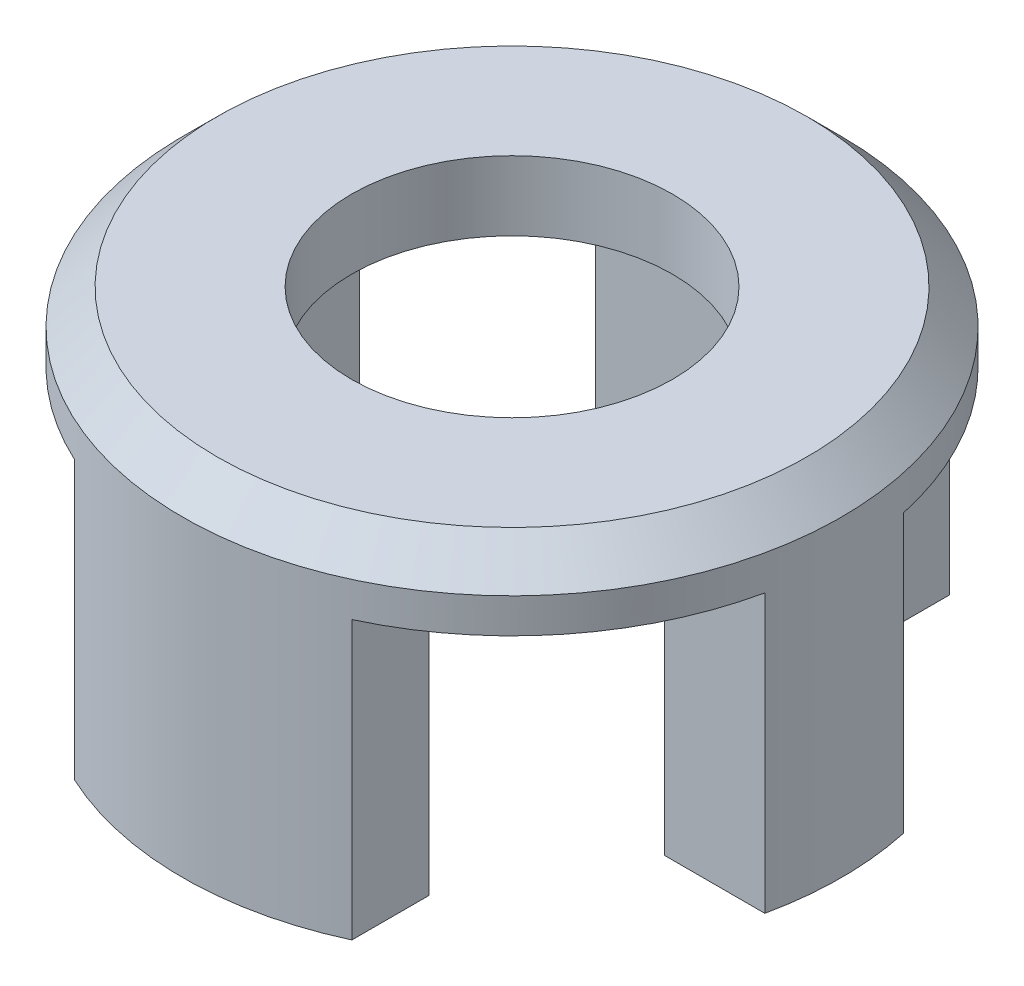
ISO-10303-21;
HEADER;
FILE_DESCRIPTION(('STEP AP214'),'2;1');
FILE_NAME('part.step','',(''),(''),'','','');
FILE_SCHEMA(('AUTOMOTIVE_DESIGN { 1 0 10303 214 1 1 1 1 }'));
ENDSEC;
DATA;
#1=APPLICATION_CONTEXT('core data for automotive mechanical design processes');
#2=APPLICATION_PROTOCOL_DEFINITION('international standard','automotive_design',2000,#1);
#3=PRODUCT_CONTEXT('',#1,'mechanical');
#4=PRODUCT('Part','Part','',(#3));
#5=PRODUCT_RELATED_PRODUCT_CATEGORY('part','',(#4));
#6=PRODUCT_DEFINITION_FORMATION('','',#4);
#7=PRODUCT_DEFINITION_CONTEXT('part definition',#1,'design');
#8=PRODUCT_DEFINITION('design','',#6,#7);
#9=PRODUCT_DEFINITION_SHAPE('','',#8);
#10=(LENGTH_UNIT() NAMED_UNIT(*) SI_UNIT(.MILLI.,.METRE.));
#11=(NAMED_UNIT(*) PLANE_ANGLE_UNIT() SI_UNIT($,.RADIAN.));
#12=(NAMED_UNIT(*) SI_UNIT($,.STERADIAN.) SOLID_ANGLE_UNIT());
#13=UNCERTAINTY_MEASURE_WITH_UNIT(LENGTH_MEASURE(1.E-05),#10,'distance_accuracy_value','');
#14=(GEOMETRIC_REPRESENTATION_CONTEXT(3) GLOBAL_UNCERTAINTY_ASSIGNED_CONTEXT((#13)) GLOBAL_UNIT_ASSIGNED_CONTEXT((#10,
#11,#12)) REPRESENTATION_CONTEXT('',''));
#15=CARTESIAN_POINT('',(0.,0.,0.));
#16=DIRECTION('',(0.,0.,1.));
#17=DIRECTION('',(1.,0.,0.));
#18=AXIS2_PLACEMENT_3D('',#15,#16,#17);
#19=CARTESIAN_POINT('',(0.,4.,0.));
#20=DIRECTION('',(0.,1.,0.));
#21=DIRECTION('',(0.,0.,1.));
#22=AXIS2_PLACEMENT_3D('',#19,#20,#21);
#23=PLANE('',#22);
#24=CARTESIAN_POINT('',(0.,4.,0.));
#25=DIRECTION('',(0.,1.,0.));
#26=DIRECTION('',(0.,0.,1.));
#27=AXIS2_PLACEMENT_3D('',#24,#25,#26);
#28=CIRCLE('',#27,2.31344709440574);
#29=CARTESIAN_POINT('',(0.,4.,2.31344709440574));
#30=VERTEX_POINT('',#29);
#31=EDGE_CURVE('E232',#30,#30,#28,.T.);
#32=ORIENTED_EDGE('',*,*,#31,.T.);
#33=EDGE_LOOP('',(#32));
#34=FACE_BOUND('',#33,.T.);
#35=DIRECTION('',(0.,0.,-1.));
#36=VECTOR('',#35,1.);
#37=CARTESIAN_POINT('',(-2.,4.,0.));
#38=LINE('',#37,#36);
#39=CARTESIAN_POINT('',(-2.,4.,-3.2));
#40=VERTEX_POINT('',#39);
#41=CARTESIAN_POINT('',(-2.,4.,-4.30842198490352));
#42=VERTEX_POINT('',#41);
#43=EDGE_CURVE('E48',#40,#42,#38,.T.);
#44=ORIENTED_EDGE('',*,*,#43,.F.);
#45=DIRECTION('',(-1.,0.,0.));
#46=VECTOR('',#45,1.);
#47=CARTESIAN_POINT('',(0.,4.,-3.2));
#48=LINE('',#47,#46);
#49=CARTESIAN_POINT('',(2.,4.,-3.2));
#50=VERTEX_POINT('',#49);
#51=EDGE_CURVE('E179',#50,#40,#48,.T.);
#52=ORIENTED_EDGE('',*,*,#51,.F.);
#53=DIRECTION('',(0.,0.,1.));
#54=VECTOR('',#53,1.);
#55=CARTESIAN_POINT('',(2.,4.,0.));
#56=LINE('',#55,#54);
#57=CARTESIAN_POINT('',(2.,4.,-4.30842198490352));
#58=VERTEX_POINT('',#57);
#59=EDGE_CURVE('E152',#58,#50,#56,.T.);
#60=ORIENTED_EDGE('',*,*,#59,.F.);
#61=CARTESIAN_POINT('',(0.,4.,0.));
#62=DIRECTION('',(0.,1.,0.));
#63=DIRECTION('',(0.,0.,1.));
#64=AXIS2_PLACEMENT_3D('',#61,#62,#63);
#65=CIRCLE('',#64,4.75);
#66=CARTESIAN_POINT('',(4.64354390525168,4.,-1.));
#67=VERTEX_POINT('',#66);
#68=EDGE_CURVE('E238',#67,#58,#65,.T.);
#69=ORIENTED_EDGE('',*,*,#68,.F.);
#70=DIRECTION('',(-1.,0.,0.));
#71=VECTOR('',#70,1.);
#72=CARTESIAN_POINT('',(3.2,4.,-1.));
#73=LINE('',#72,#71);
#74=CARTESIAN_POINT('',(3.2,4.,-1.));
#75=VERTEX_POINT('',#74);
#76=EDGE_CURVE('E240',#67,#75,#73,.T.);
#77=ORIENTED_EDGE('',*,*,#76,.T.);
#78=DIRECTION('',(0.,0.,1.));
#79=VECTOR('',#78,1.);
#80=CARTESIAN_POINT('',(3.2,4.,1.));
#81=LINE('',#80,#79);
#82=CARTESIAN_POINT('',(3.2,4.,1.));
#83=VERTEX_POINT('',#82);
#84=EDGE_CURVE('E266',#75,#83,#81,.T.);
#85=ORIENTED_EDGE('',*,*,#84,.T.);
#86=DIRECTION('',(1.,0.,0.));
#87=VECTOR('',#86,1.);
#88=CARTESIAN_POINT('',(3.2,4.,1.));
#89=LINE('',#88,#87);
#90=CARTESIAN_POINT('',(4.64354390525168,4.,1.));
#91=VERTEX_POINT('',#90);
#92=EDGE_CURVE('E243',#83,#91,#89,.T.);
#93=ORIENTED_EDGE('',*,*,#92,.T.);
#94=CARTESIAN_POINT('',(2.,4.,4.30842198490352));
#95=VERTEX_POINT('',#94);
#96=EDGE_CURVE('E235',#95,#91,#65,.T.);
#97=ORIENTED_EDGE('',*,*,#96,.F.);
#98=DIRECTION('',(0.,0.,1.));
#99=VECTOR('',#98,1.);
#100=CARTESIAN_POINT('',(2.,4.,0.));
#101=LINE('',#100,#99);
#102=CARTESIAN_POINT('',(2.,4.,3.2));
#103=VERTEX_POINT('',#102);
#104=EDGE_CURVE('E208',#103,#95,#101,.T.);
#105=ORIENTED_EDGE('',*,*,#104,.F.);
#106=DIRECTION('',(1.,0.,0.));
#107=VECTOR('',#106,1.);
#108=CARTESIAN_POINT('',(0.,4.,3.2));
#109=LINE('',#108,#107);
#110=CARTESIAN_POINT('',(-2.,4.,3.2));
#111=VERTEX_POINT('',#110);
#112=EDGE_CURVE('E205',#111,#103,#109,.T.);
#113=ORIENTED_EDGE('',*,*,#112,.F.);
#114=DIRECTION('',(0.,0.,-1.));
#115=VECTOR('',#114,1.);
#116=CARTESIAN_POINT('',(-2.,4.,0.));
#117=LINE('',#116,#115);
#118=CARTESIAN_POINT('',(-2.,4.,4.30842198490352));
#119=VERTEX_POINT('',#118);
#120=EDGE_CURVE('E202',#119,#111,#117,.T.);
#121=ORIENTED_EDGE('',*,*,#120,.F.);
#122=CARTESIAN_POINT('',(-4.64354390525168,4.,1.));
#123=VERTEX_POINT('',#122);
#124=EDGE_CURVE('E241',#123,#119,#65,.T.);
#125=ORIENTED_EDGE('',*,*,#124,.F.);
#126=DIRECTION('',(-1.,0.,0.));
#127=VECTOR('',#126,1.);
#128=CARTESIAN_POINT('',(0.,4.,1.));
#129=LINE('',#128,#127);
#130=CARTESIAN_POINT('',(-3.2,4.,1.));
#131=VERTEX_POINT('',#130);
#132=EDGE_CURVE('E274',#131,#123,#129,.T.);
#133=ORIENTED_EDGE('',*,*,#132,.F.);
#134=DIRECTION('',(0.,0.,1.));
#135=VECTOR('',#134,1.);
#136=CARTESIAN_POINT('',(-3.2,4.,0.));
#137=LINE('',#136,#135);
#138=CARTESIAN_POINT('',(-3.2,4.,-1.));
#139=VERTEX_POINT('',#138);
#140=EDGE_CURVE('E271',#139,#131,#137,.T.);
#141=ORIENTED_EDGE('',*,*,#140,.F.);
#142=DIRECTION('',(1.,0.,0.));
#143=VECTOR('',#142,1.);
#144=CARTESIAN_POINT('',(0.,4.,-1.));
#145=LINE('',#144,#143);
#146=CARTESIAN_POINT('',(-4.64354390525168,4.,-1.));
#147=VERTEX_POINT('',#146);
#148=EDGE_CURVE('E268',#147,#139,#145,.T.);
#149=ORIENTED_EDGE('',*,*,#148,.F.);
#150=EDGE_CURVE('E53',#42,#147,#65,.T.);
#151=ORIENTED_EDGE('',*,*,#150,.F.);
#152=EDGE_LOOP('',(#44,#52,#60,#69,#77,#85,#93,#97,#105,#113,#121,#125,#133,#141,#149,#151));
#153=FACE_BOUND('',#152,.T.);
#154=ADVANCED_FACE('F33',(#34,#153),#23,.F.);
#155=CARTESIAN_POINT('',(3.2,5.,1.));
#156=DIRECTION('',(0.,0.,-1.));
#157=DIRECTION('',(-1.,0.,0.));
#158=AXIS2_PLACEMENT_3D('',#155,#156,#157);
#159=PLANE('',#158);
#160=ORIENTED_EDGE('',*,*,#92,.F.);
#161=DIRECTION('',(0.,-1.,0.));
#162=VECTOR('',#161,1.);
#163=CARTESIAN_POINT('',(3.2,5.,1.));
#164=LINE('',#163,#162);
#165=CARTESIAN_POINT('',(3.2,0.,1.));
#166=VERTEX_POINT('',#165);
#167=EDGE_CURVE('E258',#83,#166,#164,.T.);
#168=ORIENTED_EDGE('',*,*,#167,.T.);
#169=DIRECTION('',(1.,0.,0.));
#170=VECTOR('',#169,1.);
#171=CARTESIAN_POINT('',(3.2,0.,1.));
#172=LINE('',#171,#170);
#173=CARTESIAN_POINT('',(4.64354390525168,0.,1.));
#174=VERTEX_POINT('',#173);
#175=EDGE_CURVE('E246',#166,#174,#172,.T.);
#176=ORIENTED_EDGE('',*,*,#175,.T.);
#177=DIRECTION('',(0.,-1.,0.));
#178=VECTOR('',#177,1.);
#179=CARTESIAN_POINT('',(4.64354390525168,5.,1.));
#180=LINE('',#179,#178);
#181=EDGE_CURVE('E264',#91,#174,#180,.T.);
#182=ORIENTED_EDGE('',*,*,#181,.F.);
#183=EDGE_LOOP('',(#160,#168,#176,#182));
#184=FACE_BOUND('',#183,.T.);
#185=ADVANCED_FACE('F291',(#184),#159,.F.);
#186=CARTESIAN_POINT('',(3.2,5.,-1.));
#187=DIRECTION('',(0.,0.,1.));
#188=DIRECTION('',(1.,0.,0.));
#189=AXIS2_PLACEMENT_3D('',#186,#187,#188);
#190=PLANE('',#189);
#191=ORIENTED_EDGE('',*,*,#76,.F.);
#192=DIRECTION('',(0.,-1.,0.));
#193=VECTOR('',#192,1.);
#194=CARTESIAN_POINT('',(4.64354390525168,5.,-1.));
#195=LINE('',#194,#193);
#196=CARTESIAN_POINT('',(4.64354390525168,0.,-1.));
#197=VERTEX_POINT('',#196);
#198=EDGE_CURVE('E262',#67,#197,#195,.T.);
#199=ORIENTED_EDGE('',*,*,#198,.T.);
#200=DIRECTION('',(-1.,0.,0.));
#201=VECTOR('',#200,1.);
#202=CARTESIAN_POINT('',(3.2,0.,-1.));
#203=LINE('',#202,#201);
#204=CARTESIAN_POINT('',(3.2,0.,-1.));
#205=VERTEX_POINT('',#204);
#206=EDGE_CURVE('E252',#197,#205,#203,.T.);
#207=ORIENTED_EDGE('',*,*,#206,.T.);
#208=DIRECTION('',(0.,-1.,0.));
#209=VECTOR('',#208,1.);
#210=CARTESIAN_POINT('',(3.2,5.,-1.));
#211=LINE('',#210,#209);
#212=EDGE_CURVE('E260',#75,#205,#211,.T.);
#213=ORIENTED_EDGE('',*,*,#212,.F.);
#214=EDGE_LOOP('',(#191,#199,#207,#213));
#215=FACE_BOUND('',#214,.T.);
#216=ADVANCED_FACE('F297',(#215),#190,.F.);
#217=CARTESIAN_POINT('',(3.2,5.,1.));
#218=DIRECTION('',(1.,0.,0.));
#219=DIRECTION('',(0.,0.,-1.));
#220=AXIS2_PLACEMENT_3D('',#217,#218,#219);
#221=PLANE('',#220);
#222=ORIENTED_EDGE('',*,*,#84,.F.);
#223=ORIENTED_EDGE('',*,*,#212,.T.);
#224=DIRECTION('',(0.,0.,1.));
#225=VECTOR('',#224,1.);
#226=CARTESIAN_POINT('',(3.2,0.,1.));
#227=LINE('',#226,#225);
#228=EDGE_CURVE('E255',#205,#166,#227,.T.);
#229=ORIENTED_EDGE('',*,*,#228,.T.);
#230=ORIENTED_EDGE('',*,*,#167,.F.);
#231=EDGE_LOOP('',(#222,#223,#229,#230));
#232=FACE_BOUND('',#231,.T.);
#233=ADVANCED_FACE('F309',(#232),#221,.F.);
#234=CARTESIAN_POINT('',(0.,5.,0.));
#235=DIRECTION('',(0.,-1.,0.));
#236=DIRECTION('',(0.,0.,-1.));
#237=AXIS2_PLACEMENT_3D('',#234,#235,#236);
#238=CYLINDRICAL_SURFACE('',#237,4.75);
#239=CARTESIAN_POINT('',(0.,4.5,0.));
#240=DIRECTION('',(0.,-1.,0.));
#241=DIRECTION('',(0.,0.,-1.));
#242=AXIS2_PLACEMENT_3D('',#239,#240,#241);
#243=CIRCLE('',#242,4.75);
#244=CARTESIAN_POINT('',(0.,4.5,-4.75));
#245=VERTEX_POINT('',#244);
#246=EDGE_CURVE('E11',#245,#245,#243,.T.);
#247=ORIENTED_EDGE('',*,*,#246,.T.);
#248=EDGE_LOOP('',(#247));
#249=FACE_BOUND('',#248,.T.);
#250=ORIENTED_EDGE('',*,*,#68,.T.);
#251=DIRECTION('',(0.,-1.,0.));
#252=VECTOR('',#251,1.);
#253=CARTESIAN_POINT('',(2.,5.,-4.30842198490352));
#254=LINE('',#253,#252);
#255=CARTESIAN_POINT('',(2.,0.,-4.30842198490352));
#256=VERTEX_POINT('',#255);
#257=EDGE_CURVE('E166',#58,#256,#254,.T.);
#258=ORIENTED_EDGE('',*,*,#257,.T.);
#259=CARTESIAN_POINT('',(0.,0.,1.39645239816133E-13));
#260=DIRECTION('',(0.,1.,0.));
#261=DIRECTION('',(0.,0.,-1.));
#262=AXIS2_PLACEMENT_3D('',#259,#260,#261);
#263=CIRCLE('',#262,4.75000000000013);
#264=CARTESIAN_POINT('',(-2.,0.,-4.30842198490352));
#265=VERTEX_POINT('',#264);
#266=EDGE_CURVE('E159',#256,#265,#263,.T.);
#267=ORIENTED_EDGE('',*,*,#266,.T.);
#268=DIRECTION('',(0.,-1.,0.));
#269=VECTOR('',#268,1.);
#270=CARTESIAN_POINT('',(-2.,5.,-4.30842198490352));
#271=LINE('',#270,#269);
#272=EDGE_CURVE('E144',#42,#265,#271,.T.);
#273=ORIENTED_EDGE('',*,*,#272,.F.);
#274=ORIENTED_EDGE('',*,*,#150,.T.);
#275=DIRECTION('',(0.,-1.,0.));
#276=VECTOR('',#275,1.);
#277=CARTESIAN_POINT('',(-4.64354390525168,5.,-1.));
#278=LINE('',#277,#276);
#279=CARTESIAN_POINT('',(-4.64354390525168,0.,-1.));
#280=VERTEX_POINT('',#279);
#281=EDGE_CURVE('E223',#147,#280,#278,.T.);
#282=ORIENTED_EDGE('',*,*,#281,.T.);
#283=CARTESIAN_POINT('',(0.,0.,0.));
#284=DIRECTION('',(0.,1.,0.));
#285=DIRECTION('',(0.,0.,-1.));
#286=AXIS2_PLACEMENT_3D('',#283,#284,#285);
#287=CIRCLE('',#286,4.75);
#288=CARTESIAN_POINT('',(-4.64354390525168,0.,1.));
#289=VERTEX_POINT('',#288);
#290=EDGE_CURVE('E211',#280,#289,#287,.T.);
#291=ORIENTED_EDGE('',*,*,#290,.T.);
#292=DIRECTION('',(0.,-1.,0.));
#293=VECTOR('',#292,1.);
#294=CARTESIAN_POINT('',(-4.64354390525168,5.,1.));
#295=LINE('',#294,#293);
#296=EDGE_CURVE('E229',#123,#289,#295,.T.);
#297=ORIENTED_EDGE('',*,*,#296,.F.);
#298=ORIENTED_EDGE('',*,*,#124,.T.);
#299=DIRECTION('',(0.,-1.,0.));
#300=VECTOR('',#299,1.);
#301=CARTESIAN_POINT('',(-2.,5.,4.30842198490352));
#302=LINE('',#301,#300);
#303=CARTESIAN_POINT('',(-2.,0.,4.30842198490352));
#304=VERTEX_POINT('',#303);
#305=EDGE_CURVE('E194',#119,#304,#302,.T.);
#306=ORIENTED_EDGE('',*,*,#305,.T.);
#307=CARTESIAN_POINT('',(0.,0.,0.));
#308=DIRECTION('',(0.,1.,0.));
#309=DIRECTION('',(0.,0.,-1.));
#310=AXIS2_PLACEMENT_3D('',#307,#308,#309);
#311=CIRCLE('',#310,4.75000000000001);
#312=CARTESIAN_POINT('',(2.,0.,4.30842198490352));
#313=VERTEX_POINT('',#312);
#314=EDGE_CURVE('E182',#304,#313,#311,.T.);
#315=ORIENTED_EDGE('',*,*,#314,.T.);
#316=DIRECTION('',(0.,-1.,0.));
#317=VECTOR('',#316,1.);
#318=CARTESIAN_POINT('',(2.,5.,4.30842198490352));
#319=LINE('',#318,#317);
#320=EDGE_CURVE('E200',#95,#313,#319,.T.);
#321=ORIENTED_EDGE('',*,*,#320,.F.);
#322=ORIENTED_EDGE('',*,*,#96,.T.);
#323=ORIENTED_EDGE('',*,*,#181,.T.);
#324=CARTESIAN_POINT('',(0.,0.,0.));
#325=DIRECTION('',(0.,1.,0.));
#326=DIRECTION('',(0.,0.,-1.));
#327=AXIS2_PLACEMENT_3D('',#324,#325,#326);
#328=CIRCLE('',#327,4.75);
#329=EDGE_CURVE('E249',#174,#197,#328,.T.);
#330=ORIENTED_EDGE('',*,*,#329,.T.);
#331=ORIENTED_EDGE('',*,*,#198,.F.);
#332=EDGE_LOOP('',(#250,#258,#267,#273,#274,#282,#291,#297,#298,#306,#315,#321,#322,#323,#330,#331));
#333=FACE_BOUND('',#332,.T.);
#334=ADVANCED_FACE('F164',(#249,#333),#238,.T.);
#335=CARTESIAN_POINT('',(0.,5.,0.));
#336=DIRECTION('',(0.,-1.,0.));
#337=DIRECTION('',(0.,0.,-1.));
#338=AXIS2_PLACEMENT_3D('',#335,#336,#337);
#339=PLANE('',#338);
#340=CARTESIAN_POINT('',(0.,5.,0.));
#341=DIRECTION('',(0.,-1.,0.));
#342=DIRECTION('',(0.,0.,-1.));
#343=AXIS2_PLACEMENT_3D('',#340,#341,#342);
#344=CIRCLE('',#343,4.25);
#345=CARTESIAN_POINT('',(0.,5.,-4.25));
#346=VERTEX_POINT('',#345);
#347=EDGE_CURVE('E41',#346,#346,#344,.F.);
#348=ORIENTED_EDGE('',*,*,#347,.T.);
#349=EDGE_LOOP('',(#348));
#350=FACE_BOUND('',#349,.T.);
#351=CARTESIAN_POINT('',(0.,5.,0.));
#352=DIRECTION('',(0.,1.,0.));
#353=DIRECTION('',(0.,0.,1.));
#354=AXIS2_PLACEMENT_3D('',#351,#352,#353);
#355=CIRCLE('',#354,2.31344709440574);
#356=CARTESIAN_POINT('',(0.,5.,2.31344709440574));
#357=VERTEX_POINT('',#356);
#358=EDGE_CURVE('E231',#357,#357,#355,.T.);
#359=ORIENTED_EDGE('',*,*,#358,.F.);
#360=EDGE_LOOP('',(#359));
#361=FACE_BOUND('',#360,.T.);
#362=ADVANCED_FACE('F279',(#350,#361),#339,.F.);
#363=CARTESIAN_POINT('',(0.,0.,0.));
#364=DIRECTION('',(0.,-1.,0.));
#365=DIRECTION('',(0.,0.,-1.));
#366=AXIS2_PLACEMENT_3D('',#363,#364,#365);
#367=PLANE('',#366);
#368=ORIENTED_EDGE('',*,*,#175,.F.);
#369=ORIENTED_EDGE('',*,*,#228,.F.);
#370=ORIENTED_EDGE('',*,*,#206,.F.);
#371=ORIENTED_EDGE('',*,*,#329,.F.);
#372=EDGE_LOOP('',(#368,#369,#370,#371));
#373=FACE_BOUND('',#372,.T.);
#374=ADVANCED_FACE('F305',(#373),#367,.T.);
#375=CARTESIAN_POINT('',(0.,4.,0.));
#376=DIRECTION('',(0.,1.,0.));
#377=DIRECTION('',(0.,0.,1.));
#378=AXIS2_PLACEMENT_3D('',#375,#376,#377);
#379=CYLINDRICAL_SURFACE('',#378,2.31344709440574);
#380=ORIENTED_EDGE('',*,*,#31,.F.);
#381=EDGE_LOOP('',(#380));
#382=FACE_BOUND('',#381,.T.);
#383=ORIENTED_EDGE('',*,*,#358,.T.);
#384=EDGE_LOOP('',(#383));
#385=FACE_BOUND('',#384,.T.);
#386=ADVANCED_FACE('F301',(#382,#385),#379,.F.);
#387=CARTESIAN_POINT('',(-4.64354390525168,5.,1.));
#388=DIRECTION('',(0.,0.,-1.));
#389=DIRECTION('',(-1.,0.,0.));
#390=AXIS2_PLACEMENT_3D('',#387,#388,#389);
#391=PLANE('',#390);
#392=DIRECTION('',(0.,-1.,0.));
#393=VECTOR('',#392,1.);
#394=CARTESIAN_POINT('',(-3.2,5.,1.));
#395=LINE('',#394,#393);
#396=CARTESIAN_POINT('',(-3.2,0.,1.));
#397=VERTEX_POINT('',#396);
#398=EDGE_CURVE('E227',#131,#397,#395,.T.);
#399=ORIENTED_EDGE('',*,*,#398,.F.);
#400=ORIENTED_EDGE('',*,*,#132,.T.);
#401=ORIENTED_EDGE('',*,*,#296,.T.);
#402=DIRECTION('',(1.,0.,0.));
#403=VECTOR('',#402,1.);
#404=CARTESIAN_POINT('',(-4.64354390525168,0.,1.));
#405=LINE('',#404,#403);
#406=EDGE_CURVE('E214',#289,#397,#405,.T.);
#407=ORIENTED_EDGE('',*,*,#406,.T.);
#408=EDGE_LOOP('',(#399,#400,#401,#407));
#409=FACE_BOUND('',#408,.T.);
#410=ADVANCED_FACE('F337',(#409),#391,.F.);
#411=CARTESIAN_POINT('',(-3.2,5.,1.));
#412=DIRECTION('',(-1.,0.,0.));
#413=DIRECTION('',(0.,0.,1.));
#414=AXIS2_PLACEMENT_3D('',#411,#412,#413);
#415=PLANE('',#414);
#416=DIRECTION('',(0.,-1.,0.));
#417=VECTOR('',#416,1.);
#418=CARTESIAN_POINT('',(-3.2,5.,-1.));
#419=LINE('',#418,#417);
#420=CARTESIAN_POINT('',(-3.2,0.,-1.));
#421=VERTEX_POINT('',#420);
#422=EDGE_CURVE('E225',#139,#421,#419,.T.);
#423=ORIENTED_EDGE('',*,*,#422,.F.);
#424=ORIENTED_EDGE('',*,*,#140,.T.);
#425=ORIENTED_EDGE('',*,*,#398,.T.);
#426=DIRECTION('',(0.,0.,-1.));
#427=VECTOR('',#426,1.);
#428=CARTESIAN_POINT('',(-3.2,0.,1.));
#429=LINE('',#428,#427);
#430=EDGE_CURVE('E217',#397,#421,#429,.T.);
#431=ORIENTED_EDGE('',*,*,#430,.T.);
#432=EDGE_LOOP('',(#423,#424,#425,#431));
#433=FACE_BOUND('',#432,.T.);
#434=ADVANCED_FACE('F344',(#433),#415,.F.);
#435=CARTESIAN_POINT('',(-3.2,5.,-1.));
#436=DIRECTION('',(0.,0.,1.));
#437=DIRECTION('',(1.,0.,0.));
#438=AXIS2_PLACEMENT_3D('',#435,#436,#437);
#439=PLANE('',#438);
#440=ORIENTED_EDGE('',*,*,#281,.F.);
#441=ORIENTED_EDGE('',*,*,#148,.T.);
#442=ORIENTED_EDGE('',*,*,#422,.T.);
#443=DIRECTION('',(-1.,0.,0.));
#444=VECTOR('',#443,1.);
#445=CARTESIAN_POINT('',(-3.2,0.,-1.));
#446=LINE('',#445,#444);
#447=EDGE_CURVE('E220',#421,#280,#446,.T.);
#448=ORIENTED_EDGE('',*,*,#447,.T.);
#449=EDGE_LOOP('',(#440,#441,#442,#448));
#450=FACE_BOUND('',#449,.T.);
#451=ADVANCED_FACE('F351',(#450),#439,.F.);
#452=CARTESIAN_POINT('',(0.,0.,0.));
#453=DIRECTION('',(0.,-1.,0.));
#454=DIRECTION('',(0.,0.,-1.));
#455=AXIS2_PLACEMENT_3D('',#452,#453,#454);
#456=PLANE('',#455);
#457=ORIENTED_EDGE('',*,*,#290,.F.);
#458=ORIENTED_EDGE('',*,*,#447,.F.);
#459=ORIENTED_EDGE('',*,*,#430,.F.);
#460=ORIENTED_EDGE('',*,*,#406,.F.);
#461=EDGE_LOOP('',(#457,#458,#459,#460));
#462=FACE_BOUND('',#461,.T.);
#463=ADVANCED_FACE('F359',(#462),#456,.T.);
#464=CARTESIAN_POINT('',(2.,5.,3.2));
#465=DIRECTION('',(-1.,0.,0.));
#466=DIRECTION('',(0.,0.,1.));
#467=AXIS2_PLACEMENT_3D('',#464,#465,#466);
#468=PLANE('',#467);
#469=DIRECTION('',(0.,-1.,0.));
#470=VECTOR('',#469,1.);
#471=CARTESIAN_POINT('',(2.,5.,3.2));
#472=LINE('',#471,#470);
#473=CARTESIAN_POINT('',(2.,0.,3.2));
#474=VERTEX_POINT('',#473);
#475=EDGE_CURVE('E198',#103,#474,#472,.T.);
#476=ORIENTED_EDGE('',*,*,#475,.F.);
#477=ORIENTED_EDGE('',*,*,#104,.T.);
#478=ORIENTED_EDGE('',*,*,#320,.T.);
#479=DIRECTION('',(0.,0.,-1.));
#480=VECTOR('',#479,1.);
#481=CARTESIAN_POINT('',(2.,0.,3.2));
#482=LINE('',#481,#480);
#483=EDGE_CURVE('E185',#313,#474,#482,.T.);
#484=ORIENTED_EDGE('',*,*,#483,.T.);
#485=EDGE_LOOP('',(#476,#477,#478,#484));
#486=FACE_BOUND('',#485,.T.);
#487=ADVANCED_FACE('F367',(#486),#468,.F.);
#488=CARTESIAN_POINT('',(-2.,5.,3.2));
#489=DIRECTION('',(0.,0.,1.));
#490=DIRECTION('',(1.,0.,0.));
#491=AXIS2_PLACEMENT_3D('',#488,#489,#490);
#492=PLANE('',#491);
#493=DIRECTION('',(0.,-1.,0.));
#494=VECTOR('',#493,1.);
#495=CARTESIAN_POINT('',(-2.,5.,3.2));
#496=LINE('',#495,#494);
#497=CARTESIAN_POINT('',(-2.,0.,3.2));
#498=VERTEX_POINT('',#497);
#499=EDGE_CURVE('E196',#111,#498,#496,.T.);
#500=ORIENTED_EDGE('',*,*,#499,.F.);
#501=ORIENTED_EDGE('',*,*,#112,.T.);
#502=ORIENTED_EDGE('',*,*,#475,.T.);
#503=DIRECTION('',(-1.,0.,0.));
#504=VECTOR('',#503,1.);
#505=CARTESIAN_POINT('',(-2.,0.,3.2));
#506=LINE('',#505,#504);
#507=EDGE_CURVE('E188',#474,#498,#506,.T.);
#508=ORIENTED_EDGE('',*,*,#507,.T.);
#509=EDGE_LOOP('',(#500,#501,#502,#508));
#510=FACE_BOUND('',#509,.T.);
#511=ADVANCED_FACE('F375',(#510),#492,.F.);
#512=CARTESIAN_POINT('',(-2.,5.,4.30842198490352));
#513=DIRECTION('',(1.,0.,0.));
#514=DIRECTION('',(0.,0.,-1.));
#515=AXIS2_PLACEMENT_3D('',#512,#513,#514);
#516=PLANE('',#515);
#517=ORIENTED_EDGE('',*,*,#305,.F.);
#518=ORIENTED_EDGE('',*,*,#120,.T.);
#519=ORIENTED_EDGE('',*,*,#499,.T.);
#520=DIRECTION('',(0.,0.,1.));
#521=VECTOR('',#520,1.);
#522=CARTESIAN_POINT('',(-2.,0.,4.30842198490352));
#523=LINE('',#522,#521);
#524=EDGE_CURVE('E191',#498,#304,#523,.T.);
#525=ORIENTED_EDGE('',*,*,#524,.T.);
#526=EDGE_LOOP('',(#517,#518,#519,#525));
#527=FACE_BOUND('',#526,.T.);
#528=ADVANCED_FACE('F383',(#527),#516,.F.);
#529=CARTESIAN_POINT('',(0.,0.,0.));
#530=DIRECTION('',(0.,-1.,0.));
#531=DIRECTION('',(0.,0.,-1.));
#532=AXIS2_PLACEMENT_3D('',#529,#530,#531);
#533=PLANE('',#532);
#534=ORIENTED_EDGE('',*,*,#314,.F.);
#535=ORIENTED_EDGE('',*,*,#524,.F.);
#536=ORIENTED_EDGE('',*,*,#507,.F.);
#537=ORIENTED_EDGE('',*,*,#483,.F.);
#538=EDGE_LOOP('',(#534,#535,#536,#537));
#539=FACE_BOUND('',#538,.T.);
#540=ADVANCED_FACE('F391',(#539),#533,.T.);
#541=CARTESIAN_POINT('',(-2.,5.,-4.30842198490352));
#542=DIRECTION('',(1.,0.,0.));
#543=DIRECTION('',(0.,0.,-1.));
#544=AXIS2_PLACEMENT_3D('',#541,#542,#543);
#545=PLANE('',#544);
#546=DIRECTION('',(0.,-1.,0.));
#547=VECTOR('',#546,1.);
#548=CARTESIAN_POINT('',(-2.,5.,-3.2));
#549=LINE('',#548,#547);
#550=CARTESIAN_POINT('',(-2.,0.,-3.2));
#551=VERTEX_POINT('',#550);
#552=EDGE_CURVE('E153',#40,#551,#549,.T.);
#553=ORIENTED_EDGE('',*,*,#552,.F.);
#554=ORIENTED_EDGE('',*,*,#43,.T.);
#555=ORIENTED_EDGE('',*,*,#272,.T.);
#556=DIRECTION('',(0.,0.,1.));
#557=VECTOR('',#556,1.);
#558=CARTESIAN_POINT('',(-2.,0.,-4.30842198490352));
#559=LINE('',#558,#557);
#560=EDGE_CURVE('E148',#265,#551,#559,.T.);
#561=ORIENTED_EDGE('',*,*,#560,.T.);
#562=EDGE_LOOP('',(#553,#554,#555,#561));
#563=FACE_BOUND('',#562,.T.);
#564=ADVANCED_FACE('F147',(#563),#545,.F.);
#565=CARTESIAN_POINT('',(-2.,5.,-3.2));
#566=DIRECTION('',(0.,0.,-1.));
#567=DIRECTION('',(-1.,0.,0.));
#568=AXIS2_PLACEMENT_3D('',#565,#566,#567);
#569=PLANE('',#568);
#570=DIRECTION('',(0.,-1.,0.));
#571=VECTOR('',#570,1.);
#572=CARTESIAN_POINT('',(2.,5.,-3.2));
#573=LINE('',#572,#571);
#574=CARTESIAN_POINT('',(2.,0.,-3.2));
#575=VERTEX_POINT('',#574);
#576=EDGE_CURVE('E174',#50,#575,#573,.T.);
#577=ORIENTED_EDGE('',*,*,#576,.F.);
#578=ORIENTED_EDGE('',*,*,#51,.T.);
#579=ORIENTED_EDGE('',*,*,#552,.T.);
#580=DIRECTION('',(1.,0.,0.));
#581=VECTOR('',#580,1.);
#582=CARTESIAN_POINT('',(-2.,0.,-3.2));
#583=LINE('',#582,#581);
#584=EDGE_CURVE('E161',#551,#575,#583,.T.);
#585=ORIENTED_EDGE('',*,*,#584,.T.);
#586=EDGE_LOOP('',(#577,#578,#579,#585));
#587=FACE_BOUND('',#586,.T.);
#588=ADVANCED_FACE('F406',(#587),#569,.F.);
#589=CARTESIAN_POINT('',(2.,5.,-3.2));
#590=DIRECTION('',(-1.,0.,0.));
#591=DIRECTION('',(0.,0.,1.));
#592=AXIS2_PLACEMENT_3D('',#589,#590,#591);
#593=PLANE('',#592);
#594=ORIENTED_EDGE('',*,*,#257,.F.);
#595=ORIENTED_EDGE('',*,*,#59,.T.);
#596=ORIENTED_EDGE('',*,*,#576,.T.);
#597=DIRECTION('',(0.,0.,-1.));
#598=VECTOR('',#597,1.);
#599=CARTESIAN_POINT('',(2.,0.,-3.2));
#600=LINE('',#599,#598);
#601=EDGE_CURVE('E171',#575,#256,#600,.T.);
#602=ORIENTED_EDGE('',*,*,#601,.T.);
#603=EDGE_LOOP('',(#594,#595,#596,#602));
#604=FACE_BOUND('',#603,.T.);
#605=ADVANCED_FACE('F287',(#604),#593,.F.);
#606=CARTESIAN_POINT('',(0.,0.,1.39645239816133E-13));
#607=DIRECTION('',(0.,-1.,0.));
#608=DIRECTION('',(0.,0.,-1.));
#609=AXIS2_PLACEMENT_3D('',#606,#607,#608);
#610=PLANE('',#609);
#611=ORIENTED_EDGE('',*,*,#266,.F.);
#612=ORIENTED_EDGE('',*,*,#601,.F.);
#613=ORIENTED_EDGE('',*,*,#584,.F.);
#614=ORIENTED_EDGE('',*,*,#560,.F.);
#615=EDGE_LOOP('',(#611,#612,#613,#614));
#616=FACE_BOUND('',#615,.T.);
#617=ADVANCED_FACE('F157',(#616),#610,.T.);
#618=CARTESIAN_POINT('',(0.,5.,0.));
#619=DIRECTION('',(0.,-1.,0.));
#620=DIRECTION('',(0.,0.,-1.));
#621=AXIS2_PLACEMENT_3D('',#618,#619,#620);
#622=CONICAL_SURFACE('',#621,4.25,0.785398163397447);
#623=ORIENTED_EDGE('',*,*,#246,.F.);
#624=EDGE_LOOP('',(#623));
#625=FACE_BOUND('',#624,.T.);
#626=ORIENTED_EDGE('',*,*,#347,.F.);
#627=EDGE_LOOP('',(#626));
#628=FACE_BOUND('',#627,.T.);
#629=ADVANCED_FACE('F35',(#625,#628),#622,.T.);
#630=CLOSED_SHELL('',(#154,#185,#216,#233,#334,#362,#374,#386,#410,#434,#451,#463,#487,#511,
#528,#540,#564,#588,#605,#617,#629));
#631=MANIFOLD_SOLID_BREP('B2',#630);
#632=ADVANCED_BREP_SHAPE_REPRESENTATION('',(#18,#631),#14);
#633=SHAPE_DEFINITION_REPRESENTATION(#9,#632);
ENDSEC;
END-ISO-10303-21;
